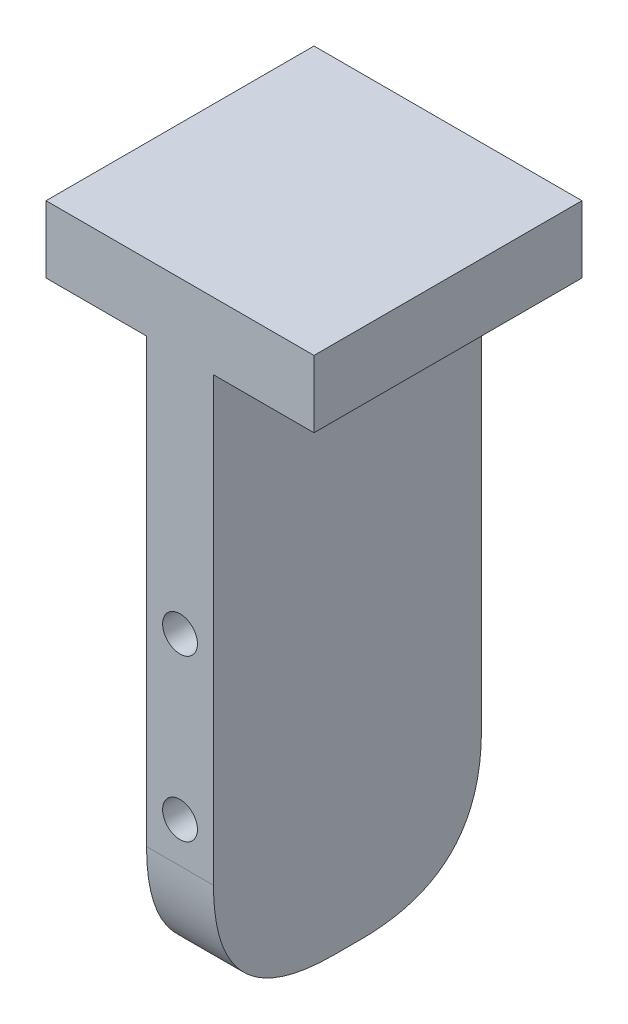
ISO-10303-21;
HEADER;
FILE_DESCRIPTION(('STEP AP214'),'2;1');
FILE_NAME('part.step','',(''),(''),'','','');
FILE_SCHEMA(('AUTOMOTIVE_DESIGN { 1 0 10303 214 1 1 1 1 }'));
ENDSEC;
DATA;
#1=APPLICATION_CONTEXT('core data for automotive mechanical design processes');
#2=APPLICATION_PROTOCOL_DEFINITION('international standard','automotive_design',2000,#1);
#3=PRODUCT_CONTEXT('',#1,'mechanical');
#4=PRODUCT('Part','Part','',(#3));
#5=PRODUCT_RELATED_PRODUCT_CATEGORY('part','',(#4));
#6=PRODUCT_DEFINITION_FORMATION('','',#4);
#7=PRODUCT_DEFINITION_CONTEXT('part definition',#1,'design');
#8=PRODUCT_DEFINITION('design','',#6,#7);
#9=PRODUCT_DEFINITION_SHAPE('','',#8);
#10=(LENGTH_UNIT() NAMED_UNIT(*) SI_UNIT(.MILLI.,.METRE.));
#11=(NAMED_UNIT(*) PLANE_ANGLE_UNIT() SI_UNIT($,.RADIAN.));
#12=(NAMED_UNIT(*) SI_UNIT($,.STERADIAN.) SOLID_ANGLE_UNIT());
#13=UNCERTAINTY_MEASURE_WITH_UNIT(LENGTH_MEASURE(1.E-05),#10,'distance_accuracy_value','');
#14=(GEOMETRIC_REPRESENTATION_CONTEXT(3) GLOBAL_UNCERTAINTY_ASSIGNED_CONTEXT((#13)) GLOBAL_UNIT_ASSIGNED_CONTEXT((#10,
#11,#12)) REPRESENTATION_CONTEXT('',''));
#15=CARTESIAN_POINT('',(0.,0.,0.));
#16=DIRECTION('',(0.,0.,1.));
#17=DIRECTION('',(1.,0.,0.));
#18=AXIS2_PLACEMENT_3D('',#15,#16,#17);
#19=CARTESIAN_POINT('',(0.,0.,0.));
#20=DIRECTION('',(0.,-1.,0.));
#21=DIRECTION('',(0.,0.,-1.));
#22=AXIS2_PLACEMENT_3D('',#19,#20,#21);
#23=PLANE('',#22);
#24=DIRECTION('',(0.,0.,1.));
#25=VECTOR('',#24,1.);
#26=CARTESIAN_POINT('',(2.5,0.,-10.));
#27=LINE('',#26,#25);
#28=CARTESIAN_POINT('',(2.5,0.,-10.));
#29=VERTEX_POINT('',#28);
#30=CARTESIAN_POINT('',(2.5,0.,10.));
#31=VERTEX_POINT('',#30);
#32=EDGE_CURVE('E172',#29,#31,#27,.T.);
#33=ORIENTED_EDGE('',*,*,#32,.F.);
#34=DIRECTION('',(-1.,0.,0.));
#35=VECTOR('',#34,1.);
#36=CARTESIAN_POINT('',(-10.,0.,-10.));
#37=LINE('',#36,#35);
#38=CARTESIAN_POINT('',(10.,0.,-10.));
#39=VERTEX_POINT('',#38);
#40=EDGE_CURVE('E445',#39,#29,#37,.T.);
#41=ORIENTED_EDGE('',*,*,#40,.F.);
#42=DIRECTION('',(0.,0.,-1.));
#43=VECTOR('',#42,1.);
#44=CARTESIAN_POINT('',(10.,0.,10.));
#45=LINE('',#44,#43);
#46=CARTESIAN_POINT('',(10.,0.,10.));
#47=VERTEX_POINT('',#46);
#48=EDGE_CURVE('E334',#47,#39,#45,.T.);
#49=ORIENTED_EDGE('',*,*,#48,.F.);
#50=DIRECTION('',(1.,0.,0.));
#51=VECTOR('',#50,1.);
#52=CARTESIAN_POINT('',(-10.,0.,10.));
#53=LINE('',#52,#51);
#54=EDGE_CURVE('E349',#31,#47,#53,.T.);
#55=ORIENTED_EDGE('',*,*,#54,.F.);
#56=EDGE_LOOP('',(#33,#41,#49,#55));
#57=FACE_BOUND('',#56,.T.);
#58=ADVANCED_FACE('F42',(#57),#23,.T.);
#59=CARTESIAN_POINT('',(10.,5.,10.));
#60=DIRECTION('',(-1.,0.,0.));
#61=DIRECTION('',(0.,0.,1.));
#62=AXIS2_PLACEMENT_3D('',#59,#60,#61);
#63=PLANE('',#62);
#64=ORIENTED_EDGE('',*,*,#48,.T.);
#65=DIRECTION('',(0.,-1.,0.));
#66=VECTOR('',#65,1.);
#67=CARTESIAN_POINT('',(10.,5.,-10.));
#68=LINE('',#67,#66);
#69=CARTESIAN_POINT('',(10.,5.,-10.));
#70=VERTEX_POINT('',#69);
#71=EDGE_CURVE('E366',#70,#39,#68,.T.);
#72=ORIENTED_EDGE('',*,*,#71,.F.);
#73=DIRECTION('',(0.,0.,-1.));
#74=VECTOR('',#73,1.);
#75=CARTESIAN_POINT('',(10.,5.,10.));
#76=LINE('',#75,#74);
#77=CARTESIAN_POINT('',(10.,5.,10.));
#78=VERTEX_POINT('',#77);
#79=EDGE_CURVE('E348',#78,#70,#76,.T.);
#80=ORIENTED_EDGE('',*,*,#79,.F.);
#81=DIRECTION('',(0.,-1.,0.));
#82=VECTOR('',#81,1.);
#83=CARTESIAN_POINT('',(10.,5.,10.));
#84=LINE('',#83,#82);
#85=EDGE_CURVE('E358',#78,#47,#84,.T.);
#86=ORIENTED_EDGE('',*,*,#85,.T.);
#87=EDGE_LOOP('',(#64,#72,#80,#86));
#88=FACE_BOUND('',#87,.T.);
#89=ADVANCED_FACE('F244',(#88),#63,.F.);
#90=CARTESIAN_POINT('',(-10.,5.,-10.));
#91=DIRECTION('',(0.,0.,1.));
#92=DIRECTION('',(1.,0.,0.));
#93=AXIS2_PLACEMENT_3D('',#90,#91,#92);
#94=PLANE('',#93);
#95=CARTESIAN_POINT('',(0.,-18.,-10.));
#96=DIRECTION('',(0.,0.,-1.));
#97=DIRECTION('',(-1.,0.,0.));
#98=AXIS2_PLACEMENT_3D('',#95,#96,#97);
#99=CIRCLE('',#98,1.3);
#100=CARTESIAN_POINT('',(-1.3,-18.,-10.));
#101=VERTEX_POINT('',#100);
#102=EDGE_CURVE('E148',#101,#101,#99,.T.);
#103=ORIENTED_EDGE('',*,*,#102,.F.);
#104=EDGE_LOOP('',(#103));
#105=FACE_BOUND('',#104,.T.);
#106=CARTESIAN_POINT('',(0.,-30.,-10.));
#107=DIRECTION('',(0.,0.,-1.));
#108=DIRECTION('',(-1.,0.,0.));
#109=AXIS2_PLACEMENT_3D('',#106,#107,#108);
#110=CIRCLE('',#109,1.3);
#111=CARTESIAN_POINT('',(-1.3,-30.,-10.));
#112=VERTEX_POINT('',#111);
#113=EDGE_CURVE('E147',#112,#112,#110,.T.);
#114=ORIENTED_EDGE('',*,*,#113,.F.);
#115=EDGE_LOOP('',(#114));
#116=FACE_BOUND('',#115,.T.);
#117=DIRECTION('',(0.,1.,0.));
#118=VECTOR('',#117,1.);
#119=CARTESIAN_POINT('',(2.5,-35.,-10.));
#120=LINE('',#119,#118);
#121=CARTESIAN_POINT('',(2.5,-33.,-10.));
#122=VERTEX_POINT('',#121);
#123=EDGE_CURVE('E178',#122,#29,#120,.T.);
#124=ORIENTED_EDGE('',*,*,#123,.F.);
#125=CARTESIAN_POINT('',(-2.75,-33.,-10.));
#126=CARTESIAN_POINT('',(-0.916666666666669,-33.,-10.));
#127=CARTESIAN_POINT('',(0.916666666666668,-33.,-10.));
#128=CARTESIAN_POINT('',(2.75,-33.,-10.));
#129=(BOUNDED_CURVE() B_SPLINE_CURVE(3,(#125,#126,#127,#128),.UNSPECIFIED.,.F.,
.F.) B_SPLINE_CURVE_WITH_KNOTS((4,4),(-0.00275,0.00275),
.UNSPECIFIED.) CURVE() GEOMETRIC_REPRESENTATION_ITEM() RATIONAL_B_SPLINE_CURVE((1.,1.,1.,1.)) REPRESENTATION_ITEM(''));
#130=CARTESIAN_POINT('',(-2.5,-33.,-10.));
#131=VERTEX_POINT('',#130);
#132=EDGE_CURVE('E72',#122,#131,#129,.F.);
#133=ORIENTED_EDGE('',*,*,#132,.T.);
#134=DIRECTION('',(0.,1.,0.));
#135=VECTOR('',#134,1.);
#136=CARTESIAN_POINT('',(-2.5,-35.,-10.));
#137=LINE('',#136,#135);
#138=CARTESIAN_POINT('',(-2.5,0.,-10.));
#139=VERTEX_POINT('',#138);
#140=EDGE_CURVE('E186',#131,#139,#137,.T.);
#141=ORIENTED_EDGE('',*,*,#140,.T.);
#142=CARTESIAN_POINT('',(-10.,0.,-10.));
#143=VERTEX_POINT('',#142);
#144=EDGE_CURVE('E336',#139,#143,#37,.T.);
#145=ORIENTED_EDGE('',*,*,#144,.T.);
#146=DIRECTION('',(0.,-1.,0.));
#147=VECTOR('',#146,1.);
#148=CARTESIAN_POINT('',(-10.,5.,-10.));
#149=LINE('',#148,#147);
#150=CARTESIAN_POINT('',(-10.,5.,-10.));
#151=VERTEX_POINT('',#150);
#152=EDGE_CURVE('E363',#151,#143,#149,.T.);
#153=ORIENTED_EDGE('',*,*,#152,.F.);
#154=DIRECTION('',(-1.,0.,0.));
#155=VECTOR('',#154,1.);
#156=CARTESIAN_POINT('',(-10.,5.,-10.));
#157=LINE('',#156,#155);
#158=EDGE_CURVE('E352',#70,#151,#157,.T.);
#159=ORIENTED_EDGE('',*,*,#158,.F.);
#160=ORIENTED_EDGE('',*,*,#71,.T.);
#161=ORIENTED_EDGE('',*,*,#40,.T.);
#162=EDGE_LOOP('',(#124,#133,#141,#145,#153,#159,#160,#161));
#163=FACE_BOUND('',#162,.T.);
#164=ADVANCED_FACE('F233',(#105,#116,#163),#94,.F.);
#165=CARTESIAN_POINT('',(-10.,5.,10.));
#166=DIRECTION('',(1.,0.,0.));
#167=DIRECTION('',(0.,0.,-1.));
#168=AXIS2_PLACEMENT_3D('',#165,#166,#167);
#169=PLANE('',#168);
#170=DIRECTION('',(0.,0.,1.));
#171=VECTOR('',#170,1.);
#172=CARTESIAN_POINT('',(-10.,0.,10.));
#173=LINE('',#172,#171);
#174=CARTESIAN_POINT('',(-10.,0.,10.));
#175=VERTEX_POINT('',#174);
#176=EDGE_CURVE('E354',#143,#175,#173,.T.);
#177=ORIENTED_EDGE('',*,*,#176,.T.);
#178=DIRECTION('',(0.,-1.,0.));
#179=VECTOR('',#178,1.);
#180=CARTESIAN_POINT('',(-10.,5.,10.));
#181=LINE('',#180,#179);
#182=CARTESIAN_POINT('',(-10.,5.,10.));
#183=VERTEX_POINT('',#182);
#184=EDGE_CURVE('E347',#183,#175,#181,.T.);
#185=ORIENTED_EDGE('',*,*,#184,.F.);
#186=DIRECTION('',(0.,0.,1.));
#187=VECTOR('',#186,1.);
#188=CARTESIAN_POINT('',(-10.,5.,10.));
#189=LINE('',#188,#187);
#190=EDGE_CURVE('E447',#151,#183,#189,.T.);
#191=ORIENTED_EDGE('',*,*,#190,.F.);
#192=ORIENTED_EDGE('',*,*,#152,.T.);
#193=EDGE_LOOP('',(#177,#185,#191,#192));
#194=FACE_BOUND('',#193,.T.);
#195=ADVANCED_FACE('F243',(#194),#169,.F.);
#196=CARTESIAN_POINT('',(-10.,5.,10.));
#197=DIRECTION('',(0.,0.,-1.));
#198=DIRECTION('',(-1.,0.,0.));
#199=AXIS2_PLACEMENT_3D('',#196,#197,#198);
#200=PLANE('',#199);
#201=CARTESIAN_POINT('',(0.,-18.,10.));
#202=DIRECTION('',(0.,0.,1.));
#203=DIRECTION('',(1.,0.,0.));
#204=AXIS2_PLACEMENT_3D('',#201,#202,#203);
#205=CIRCLE('',#204,1.3);
#206=CARTESIAN_POINT('',(1.3,-18.,10.));
#207=VERTEX_POINT('',#206);
#208=EDGE_CURVE('E160',#207,#207,#205,.T.);
#209=ORIENTED_EDGE('',*,*,#208,.F.);
#210=EDGE_LOOP('',(#209));
#211=FACE_BOUND('',#210,.T.);
#212=CARTESIAN_POINT('',(0.,-30.,10.));
#213=DIRECTION('',(0.,0.,1.));
#214=DIRECTION('',(1.,0.,0.));
#215=AXIS2_PLACEMENT_3D('',#212,#213,#214);
#216=CIRCLE('',#215,1.3);
#217=CARTESIAN_POINT('',(1.3,-30.,10.));
#218=VERTEX_POINT('',#217);
#219=EDGE_CURVE('E166',#218,#218,#216,.T.);
#220=ORIENTED_EDGE('',*,*,#219,.F.);
#221=EDGE_LOOP('',(#220));
#222=FACE_BOUND('',#221,.T.);
#223=DIRECTION('',(0.,1.,0.));
#224=VECTOR('',#223,1.);
#225=CARTESIAN_POINT('',(-2.5,-35.,10.));
#226=LINE('',#225,#224);
#227=CARTESIAN_POINT('',(-2.5,-33.,10.));
#228=VERTEX_POINT('',#227);
#229=CARTESIAN_POINT('',(-2.5,0.,10.));
#230=VERTEX_POINT('',#229);
#231=EDGE_CURVE('E227',#228,#230,#226,.T.);
#232=ORIENTED_EDGE('',*,*,#231,.F.);
#233=CARTESIAN_POINT('',(2.75,-33.,10.));
#234=CARTESIAN_POINT('',(0.916666666666665,-33.,10.));
#235=CARTESIAN_POINT('',(-0.916666666666669,-33.,10.));
#236=CARTESIAN_POINT('',(-2.75,-33.,10.));
#237=(BOUNDED_CURVE() B_SPLINE_CURVE(3,(#233,#234,#235,#236),.UNSPECIFIED.,.F.,
.F.) B_SPLINE_CURVE_WITH_KNOTS((4,4),(-0.00275,0.00275),
.UNSPECIFIED.) CURVE() GEOMETRIC_REPRESENTATION_ITEM() RATIONAL_B_SPLINE_CURVE((1.,1.,1.,1.)) REPRESENTATION_ITEM(''));
#238=CARTESIAN_POINT('',(2.5,-33.,10.));
#239=VERTEX_POINT('',#238);
#240=EDGE_CURVE('E12',#228,#239,#237,.F.);
#241=ORIENTED_EDGE('',*,*,#240,.T.);
#242=DIRECTION('',(0.,1.,0.));
#243=VECTOR('',#242,1.);
#244=CARTESIAN_POINT('',(2.5,-35.,10.));
#245=LINE('',#244,#243);
#246=EDGE_CURVE('E187',#239,#31,#245,.T.);
#247=ORIENTED_EDGE('',*,*,#246,.T.);
#248=ORIENTED_EDGE('',*,*,#54,.T.);
#249=ORIENTED_EDGE('',*,*,#85,.F.);
#250=DIRECTION('',(1.,0.,0.));
#251=VECTOR('',#250,1.);
#252=CARTESIAN_POINT('',(-10.,5.,10.));
#253=LINE('',#252,#251);
#254=EDGE_CURVE('E361',#183,#78,#253,.T.);
#255=ORIENTED_EDGE('',*,*,#254,.F.);
#256=ORIENTED_EDGE('',*,*,#184,.T.);
#257=EDGE_CURVE('E343',#175,#230,#53,.T.);
#258=ORIENTED_EDGE('',*,*,#257,.T.);
#259=EDGE_LOOP('',(#232,#241,#247,#248,#249,#255,#256,#258));
#260=FACE_BOUND('',#259,.T.);
#261=ADVANCED_FACE('F328',(#211,#222,#260),#200,.F.);
#262=CARTESIAN_POINT('',(0.,5.,0.));
#263=DIRECTION('',(0.,-1.,0.));
#264=DIRECTION('',(0.,0.,-1.));
#265=AXIS2_PLACEMENT_3D('',#262,#263,#264);
#266=PLANE('',#265);
#267=ORIENTED_EDGE('',*,*,#79,.T.);
#268=ORIENTED_EDGE('',*,*,#158,.T.);
#269=ORIENTED_EDGE('',*,*,#190,.T.);
#270=ORIENTED_EDGE('',*,*,#254,.T.);
#271=EDGE_LOOP('',(#267,#268,#269,#270));
#272=FACE_BOUND('',#271,.T.);
#273=ADVANCED_FACE('F216',(#272),#266,.F.);
#274=DIRECTION('',(0.,0.,-1.));
#275=VECTOR('',#274,1.);
#276=CARTESIAN_POINT('',(-2.5,0.,-10.));
#277=LINE('',#276,#275);
#278=EDGE_CURVE('E175',#230,#139,#277,.T.);
#279=ORIENTED_EDGE('',*,*,#278,.F.);
#280=ORIENTED_EDGE('',*,*,#257,.F.);
#281=ORIENTED_EDGE('',*,*,#176,.F.);
#282=ORIENTED_EDGE('',*,*,#144,.F.);
#283=EDGE_LOOP('',(#279,#280,#281,#282));
#284=FACE_BOUND('',#283,.T.);
#285=ADVANCED_FACE('F213',(#284),#23,.T.);
#286=CARTESIAN_POINT('',(2.5,-35.,-10.));
#287=DIRECTION('',(-1.,0.,0.));
#288=DIRECTION('',(0.,0.,1.));
#289=AXIS2_PLACEMENT_3D('',#286,#287,#288);
#290=PLANE('',#289);
#291=DIRECTION('',(0.,0.,1.));
#292=VECTOR('',#291,1.);
#293=CARTESIAN_POINT('',(2.5,-42.,-10.));
#294=LINE('',#293,#292);
#295=CARTESIAN_POINT('',(2.5,-42.,-1.));
#296=VERTEX_POINT('',#295);
#297=CARTESIAN_POINT('',(2.5,-42.,1.));
#298=VERTEX_POINT('',#297);
#299=EDGE_CURVE('E369',#296,#298,#294,.T.);
#300=ORIENTED_EDGE('',*,*,#299,.F.);
#301=CARTESIAN_POINT('',(2.5,-33.,-10.));
#302=CARTESIAN_POINT('',(2.5,-42.,-10.));
#303=CARTESIAN_POINT('',(2.5,-42.,-1.));
#304=(BOUNDED_CURVE() B_SPLINE_CURVE(2,(#301,#302,#303),.UNSPECIFIED.,.F.,
.F.) B_SPLINE_CURVE_WITH_KNOTS((3,3),(0.,1.),
.UNSPECIFIED.) CURVE() GEOMETRIC_REPRESENTATION_ITEM() RATIONAL_B_SPLINE_CURVE((1.,1.,1.)) REPRESENTATION_ITEM(''));
#305=EDGE_CURVE('E595',#296,#122,#304,.F.);
#306=ORIENTED_EDGE('',*,*,#305,.T.);
#307=ORIENTED_EDGE('',*,*,#123,.T.);
#308=ORIENTED_EDGE('',*,*,#32,.T.);
#309=ORIENTED_EDGE('',*,*,#246,.F.);
#310=CARTESIAN_POINT('',(2.5,-42.,1.));
#311=CARTESIAN_POINT('',(2.5,-42.,10.));
#312=CARTESIAN_POINT('',(2.5,-33.,10.));
#313=(BOUNDED_CURVE() B_SPLINE_CURVE(2,(#310,#311,#312),.UNSPECIFIED.,.F.,
.F.) B_SPLINE_CURVE_WITH_KNOTS((3,3),(0.,1.),
.UNSPECIFIED.) CURVE() GEOMETRIC_REPRESENTATION_ITEM() RATIONAL_B_SPLINE_CURVE((1.,1.,1.)) REPRESENTATION_ITEM(''));
#314=EDGE_CURVE('E195',#239,#298,#313,.F.);
#315=ORIENTED_EDGE('',*,*,#314,.T.);
#316=EDGE_LOOP('',(#300,#306,#307,#308,#309,#315));
#317=FACE_BOUND('',#316,.T.);
#318=ADVANCED_FACE('F202',(#317),#290,.F.);
#319=CARTESIAN_POINT('',(-2.5,-35.,-10.));
#320=DIRECTION('',(1.,0.,0.));
#321=DIRECTION('',(0.,0.,-1.));
#322=AXIS2_PLACEMENT_3D('',#319,#320,#321);
#323=PLANE('',#322);
#324=ORIENTED_EDGE('',*,*,#140,.F.);
#325=CARTESIAN_POINT('',(-2.5,-42.,-1.));
#326=CARTESIAN_POINT('',(-2.5,-42.,-10.));
#327=CARTESIAN_POINT('',(-2.5,-33.,-10.));
#328=(BOUNDED_CURVE() B_SPLINE_CURVE(2,(#325,#326,#327),.UNSPECIFIED.,.F.,
.F.) B_SPLINE_CURVE_WITH_KNOTS((3,3),(0.,1.),
.UNSPECIFIED.) CURVE() GEOMETRIC_REPRESENTATION_ITEM() RATIONAL_B_SPLINE_CURVE((1.,1.,1.)) REPRESENTATION_ITEM(''));
#329=CARTESIAN_POINT('',(-2.5,-42.,-1.));
#330=VERTEX_POINT('',#329);
#331=EDGE_CURVE('E56',#131,#330,#328,.F.);
#332=ORIENTED_EDGE('',*,*,#331,.T.);
#333=DIRECTION('',(0.,0.,-1.));
#334=VECTOR('',#333,1.);
#335=CARTESIAN_POINT('',(-2.5,-42.,-10.));
#336=LINE('',#335,#334);
#337=CARTESIAN_POINT('',(-2.5,-42.,1.));
#338=VERTEX_POINT('',#337);
#339=EDGE_CURVE('E154',#338,#330,#336,.T.);
#340=ORIENTED_EDGE('',*,*,#339,.F.);
#341=CARTESIAN_POINT('',(-2.5,-33.,10.));
#342=CARTESIAN_POINT('',(-2.5,-42.,10.));
#343=CARTESIAN_POINT('',(-2.5,-42.,1.));
#344=(BOUNDED_CURVE() B_SPLINE_CURVE(2,(#341,#342,#343),.UNSPECIFIED.,.F.,
.F.) B_SPLINE_CURVE_WITH_KNOTS((3,3),(0.,1.),
.UNSPECIFIED.) CURVE() GEOMETRIC_REPRESENTATION_ITEM() RATIONAL_B_SPLINE_CURVE((1.,1.,1.)) REPRESENTATION_ITEM(''));
#345=EDGE_CURVE('E63',#338,#228,#344,.F.);
#346=ORIENTED_EDGE('',*,*,#345,.T.);
#347=ORIENTED_EDGE('',*,*,#231,.T.);
#348=ORIENTED_EDGE('',*,*,#278,.T.);
#349=EDGE_LOOP('',(#324,#332,#340,#346,#347,#348));
#350=FACE_BOUND('',#349,.T.);
#351=ADVANCED_FACE('F212',(#350),#323,.F.);
#352=CARTESIAN_POINT('',(0.,-30.,3.5));
#353=DIRECTION('',(0.,0.,1.));
#354=DIRECTION('',(1.,0.,0.));
#355=AXIS2_PLACEMENT_3D('',#352,#353,#354);
#356=CONICAL_SURFACE('',#355,1.3,1.02974425867665);
#357=CARTESIAN_POINT('',(0.,-30.,2.71888119526417));
#358=VERTEX_POINT('',#357);
#359=VERTEX_LOOP('',#358);
#360=FACE_BOUND('',#359,.T.);
#361=CARTESIAN_POINT('',(0.,-30.,3.5));
#362=DIRECTION('',(0.,0.,1.));
#363=DIRECTION('',(1.,0.,0.));
#364=AXIS2_PLACEMENT_3D('',#361,#362,#363);
#365=CIRCLE('',#364,1.3);
#366=CARTESIAN_POINT('',(1.3,-30.,3.5));
#367=VERTEX_POINT('',#366);
#368=EDGE_CURVE('E169',#367,#367,#365,.T.);
#369=ORIENTED_EDGE('',*,*,#368,.T.);
#370=EDGE_LOOP('',(#369));
#371=FACE_BOUND('',#370,.T.);
#372=ADVANCED_FACE('F418',(#360,#371),#356,.F.);
#373=CARTESIAN_POINT('',(0.,-30.,10.));
#374=DIRECTION('',(0.,0.,1.));
#375=DIRECTION('',(1.,0.,0.));
#376=AXIS2_PLACEMENT_3D('',#373,#374,#375);
#377=CYLINDRICAL_SURFACE('',#376,1.3);
#378=ORIENTED_EDGE('',*,*,#368,.F.);
#379=EDGE_LOOP('',(#378));
#380=FACE_BOUND('',#379,.T.);
#381=ORIENTED_EDGE('',*,*,#219,.T.);
#382=EDGE_LOOP('',(#381));
#383=FACE_BOUND('',#382,.T.);
#384=ADVANCED_FACE('F415',(#380,#383),#377,.F.);
#385=CARTESIAN_POINT('',(0.,-18.,3.5));
#386=DIRECTION('',(0.,0.,1.));
#387=DIRECTION('',(1.,0.,0.));
#388=AXIS2_PLACEMENT_3D('',#385,#386,#387);
#389=CONICAL_SURFACE('',#388,1.3,1.02974425867665);
#390=CARTESIAN_POINT('',(0.,-18.,2.71888119526417));
#391=VERTEX_POINT('',#390);
#392=VERTEX_LOOP('',#391);
#393=FACE_BOUND('',#392,.T.);
#394=CARTESIAN_POINT('',(0.,-18.,3.5));
#395=DIRECTION('',(0.,0.,1.));
#396=DIRECTION('',(1.,0.,0.));
#397=AXIS2_PLACEMENT_3D('',#394,#395,#396);
#398=CIRCLE('',#397,1.3);
#399=CARTESIAN_POINT('',(1.3,-18.,3.5));
#400=VERTEX_POINT('',#399);
#401=EDGE_CURVE('E163',#400,#400,#398,.T.);
#402=ORIENTED_EDGE('',*,*,#401,.T.);
#403=EDGE_LOOP('',(#402));
#404=FACE_BOUND('',#403,.T.);
#405=ADVANCED_FACE('F411',(#393,#404),#389,.F.);
#406=CARTESIAN_POINT('',(0.,-18.,10.));
#407=DIRECTION('',(0.,0.,1.));
#408=DIRECTION('',(1.,0.,0.));
#409=AXIS2_PLACEMENT_3D('',#406,#407,#408);
#410=CYLINDRICAL_SURFACE('',#409,1.3);
#411=ORIENTED_EDGE('',*,*,#401,.F.);
#412=EDGE_LOOP('',(#411));
#413=FACE_BOUND('',#412,.T.);
#414=ORIENTED_EDGE('',*,*,#208,.T.);
#415=EDGE_LOOP('',(#414));
#416=FACE_BOUND('',#415,.T.);
#417=ADVANCED_FACE('F407',(#413,#416),#410,.F.);
#418=CARTESIAN_POINT('',(0.,-30.,-3.5));
#419=DIRECTION('',(0.,0.,-1.));
#420=DIRECTION('',(-1.,0.,0.));
#421=AXIS2_PLACEMENT_3D('',#418,#419,#420);
#422=CONICAL_SURFACE('',#421,1.3,1.02974425867665);
#423=CARTESIAN_POINT('',(0.,-30.,-2.71888119526417));
#424=VERTEX_POINT('',#423);
#425=VERTEX_LOOP('',#424);
#426=FACE_BOUND('',#425,.T.);
#427=CARTESIAN_POINT('',(0.,-30.,-3.5));
#428=DIRECTION('',(0.,0.,-1.));
#429=DIRECTION('',(-1.,0.,0.));
#430=AXIS2_PLACEMENT_3D('',#427,#428,#429);
#431=CIRCLE('',#430,1.3);
#432=CARTESIAN_POINT('',(-1.3,-30.,-3.5));
#433=VERTEX_POINT('',#432);
#434=EDGE_CURVE('E151',#433,#433,#431,.T.);
#435=ORIENTED_EDGE('',*,*,#434,.T.);
#436=EDGE_LOOP('',(#435));
#437=FACE_BOUND('',#436,.T.);
#438=ADVANCED_FACE('F403',(#426,#437),#422,.F.);
#439=CARTESIAN_POINT('',(0.,-30.,-10.));
#440=DIRECTION('',(0.,0.,-1.));
#441=DIRECTION('',(-1.,0.,0.));
#442=AXIS2_PLACEMENT_3D('',#439,#440,#441);
#443=CYLINDRICAL_SURFACE('',#442,1.3);
#444=ORIENTED_EDGE('',*,*,#434,.F.);
#445=EDGE_LOOP('',(#444));
#446=FACE_BOUND('',#445,.T.);
#447=ORIENTED_EDGE('',*,*,#113,.T.);
#448=EDGE_LOOP('',(#447));
#449=FACE_BOUND('',#448,.T.);
#450=ADVANCED_FACE('F141',(#446,#449),#443,.F.);
#451=CARTESIAN_POINT('',(0.,-18.,-3.5));
#452=DIRECTION('',(0.,0.,-1.));
#453=DIRECTION('',(-1.,0.,0.));
#454=AXIS2_PLACEMENT_3D('',#451,#452,#453);
#455=CONICAL_SURFACE('',#454,1.3,1.02974425867665);
#456=CARTESIAN_POINT('',(0.,-18.,-2.71888119526417));
#457=VERTEX_POINT('',#456);
#458=VERTEX_LOOP('',#457);
#459=FACE_BOUND('',#458,.T.);
#460=CARTESIAN_POINT('',(0.,-18.,-3.5));
#461=DIRECTION('',(0.,0.,-1.));
#462=DIRECTION('',(-1.,0.,0.));
#463=AXIS2_PLACEMENT_3D('',#460,#461,#462);
#464=CIRCLE('',#463,1.3);
#465=CARTESIAN_POINT('',(-1.3,-18.,-3.5));
#466=VERTEX_POINT('',#465);
#467=EDGE_CURVE('E145',#466,#466,#464,.T.);
#468=ORIENTED_EDGE('',*,*,#467,.T.);
#469=EDGE_LOOP('',(#468));
#470=FACE_BOUND('',#469,.T.);
#471=ADVANCED_FACE('F137',(#459,#470),#455,.F.);
#472=CARTESIAN_POINT('',(0.,-18.,-10.));
#473=DIRECTION('',(0.,0.,-1.));
#474=DIRECTION('',(-1.,0.,0.));
#475=AXIS2_PLACEMENT_3D('',#472,#473,#474);
#476=CYLINDRICAL_SURFACE('',#475,1.3);
#477=ORIENTED_EDGE('',*,*,#467,.F.);
#478=EDGE_LOOP('',(#477));
#479=FACE_BOUND('',#478,.T.);
#480=ORIENTED_EDGE('',*,*,#102,.T.);
#481=EDGE_LOOP('',(#480));
#482=FACE_BOUND('',#481,.T.);
#483=ADVANCED_FACE('F140',(#479,#482),#476,.F.);
#484=CARTESIAN_POINT('',(0.,-42.,0.));
#485=DIRECTION('',(0.,-1.,0.));
#486=DIRECTION('',(0.,0.,-1.));
#487=AXIS2_PLACEMENT_3D('',#484,#485,#486);
#488=PLANE('',#487);
#489=ORIENTED_EDGE('',*,*,#339,.T.);
#490=CARTESIAN_POINT('',(2.75,-42.,-1.));
#491=CARTESIAN_POINT('',(0.916666666666668,-42.,-1.));
#492=CARTESIAN_POINT('',(-0.916666666666669,-42.,-1.));
#493=CARTESIAN_POINT('',(-2.75,-42.,-1.));
#494=(BOUNDED_CURVE() B_SPLINE_CURVE(3,(#490,#491,#492,#493),.UNSPECIFIED.,.F.,
.F.) B_SPLINE_CURVE_WITH_KNOTS((4,4),(-0.00275,0.00275),
.UNSPECIFIED.) CURVE() GEOMETRIC_REPRESENTATION_ITEM() RATIONAL_B_SPLINE_CURVE((1.,1.,1.,1.)) REPRESENTATION_ITEM(''));
#495=EDGE_CURVE('E594',#330,#296,#494,.F.);
#496=ORIENTED_EDGE('',*,*,#495,.T.);
#497=ORIENTED_EDGE('',*,*,#299,.T.);
#498=CARTESIAN_POINT('',(-2.75,-42.,1.));
#499=CARTESIAN_POINT('',(-0.916666666666669,-42.,1.));
#500=CARTESIAN_POINT('',(0.916666666666665,-42.,1.));
#501=CARTESIAN_POINT('',(2.75,-42.,1.));
#502=(BOUNDED_CURVE() B_SPLINE_CURVE(3,(#498,#499,#500,#501),.UNSPECIFIED.,.F.,
.F.) B_SPLINE_CURVE_WITH_KNOTS((4,4),(-0.00275,0.00275),
.UNSPECIFIED.) CURVE() GEOMETRIC_REPRESENTATION_ITEM() RATIONAL_B_SPLINE_CURVE((1.,1.,1.,1.)) REPRESENTATION_ITEM(''));
#503=EDGE_CURVE('E309',#298,#338,#502,.F.);
#504=ORIENTED_EDGE('',*,*,#503,.T.);
#505=EDGE_LOOP('',(#489,#496,#497,#504));
#506=FACE_BOUND('',#505,.T.);
#507=ADVANCED_FACE('F257',(#506),#488,.T.);
#508=CARTESIAN_POINT('',(2.75,-33.,-10.));
#509=CARTESIAN_POINT('',(0.916666666666668,-33.,-10.));
#510=CARTESIAN_POINT('',(-0.916666666666669,-33.,-10.));
#511=CARTESIAN_POINT('',(-2.75,-33.,-10.));
#512=CARTESIAN_POINT('',(2.75,-42.,-10.));
#513=CARTESIAN_POINT('',(0.916666666666668,-42.,-10.));
#514=CARTESIAN_POINT('',(-0.916666666666669,-42.,-10.));
#515=CARTESIAN_POINT('',(-2.75,-42.,-10.));
#516=CARTESIAN_POINT('',(2.75,-42.,-1.));
#517=CARTESIAN_POINT('',(0.916666666666668,-42.,-1.));
#518=CARTESIAN_POINT('',(-0.916666666666669,-42.,-1.));
#519=CARTESIAN_POINT('',(-2.75,-42.,-1.));
#520=(BOUNDED_SURFACE() B_SPLINE_SURFACE(2,3,((#508,#509,#510,#511),(#512,#513,#514,#515),(#516,
#517,#518,#519)),.UNSPECIFIED.,.F.,.F.,.F.) B_SPLINE_SURFACE_WITH_KNOTS((3,3),(4,4),(0.,1.),
(-0.00275,0.00275),
.UNSPECIFIED.) GEOMETRIC_REPRESENTATION_ITEM() RATIONAL_B_SPLINE_SURFACE(((1.,1.,1.,1.),(1.,1.,
1.,1.),(1.,1.,1.,1.))) REPRESENTATION_ITEM('') SURFACE());
#521=ORIENTED_EDGE('',*,*,#331,.F.);
#522=ORIENTED_EDGE('',*,*,#132,.F.);
#523=ORIENTED_EDGE('',*,*,#305,.F.);
#524=ORIENTED_EDGE('',*,*,#495,.F.);
#525=EDGE_LOOP('',(#521,#522,#523,#524));
#526=FACE_BOUND('',#525,.T.);
#527=ADVANCED_FACE('F250',(#526),#520,.T.);
#528=CARTESIAN_POINT('',(-2.75,-33.,10.));
#529=CARTESIAN_POINT('',(-0.916666666666669,-33.,10.));
#530=CARTESIAN_POINT('',(0.916666666666665,-33.,10.));
#531=CARTESIAN_POINT('',(2.75,-33.,10.));
#532=CARTESIAN_POINT('',(-2.75,-42.,10.));
#533=CARTESIAN_POINT('',(-0.916666666666669,-42.,10.));
#534=CARTESIAN_POINT('',(0.916666666666667,-42.,10.));
#535=CARTESIAN_POINT('',(2.75,-42.,10.));
#536=CARTESIAN_POINT('',(-2.75,-42.,1.));
#537=CARTESIAN_POINT('',(-0.916666666666669,-42.,1.));
#538=CARTESIAN_POINT('',(0.916666666666665,-42.,1.));
#539=CARTESIAN_POINT('',(2.75,-42.,1.));
#540=(BOUNDED_SURFACE() B_SPLINE_SURFACE(2,3,((#528,#529,#530,#531),(#532,#533,#534,#535),(#536,
#537,#538,#539)),.UNSPECIFIED.,.F.,.F.,.F.) B_SPLINE_SURFACE_WITH_KNOTS((3,3),(4,4),(0.,1.),
(-0.00275,0.00275),
.UNSPECIFIED.) GEOMETRIC_REPRESENTATION_ITEM() RATIONAL_B_SPLINE_SURFACE(((1.,1.,1.,1.),(1.,1.,
1.,1.),(1.,1.,1.,1.))) REPRESENTATION_ITEM('') SURFACE());
#541=ORIENTED_EDGE('',*,*,#314,.F.);
#542=ORIENTED_EDGE('',*,*,#240,.F.);
#543=ORIENTED_EDGE('',*,*,#345,.F.);
#544=ORIENTED_EDGE('',*,*,#503,.F.);
#545=EDGE_LOOP('',(#541,#542,#543,#544));
#546=FACE_BOUND('',#545,.T.);
#547=ADVANCED_FACE('F45',(#546),#540,.T.);
#548=CLOSED_SHELL('',(#58,#89,#164,#195,#261,#273,#285,#318,#351,#372,#384,#405,#417,#438,#450,
#471,#483,#507,#527,#547));
#549=MANIFOLD_SOLID_BREP('B2',#548);
#550=ADVANCED_BREP_SHAPE_REPRESENTATION('',(#18,#549),#14);
#551=SHAPE_DEFINITION_REPRESENTATION(#9,#550);
ENDSEC;
END-ISO-10303-21;
